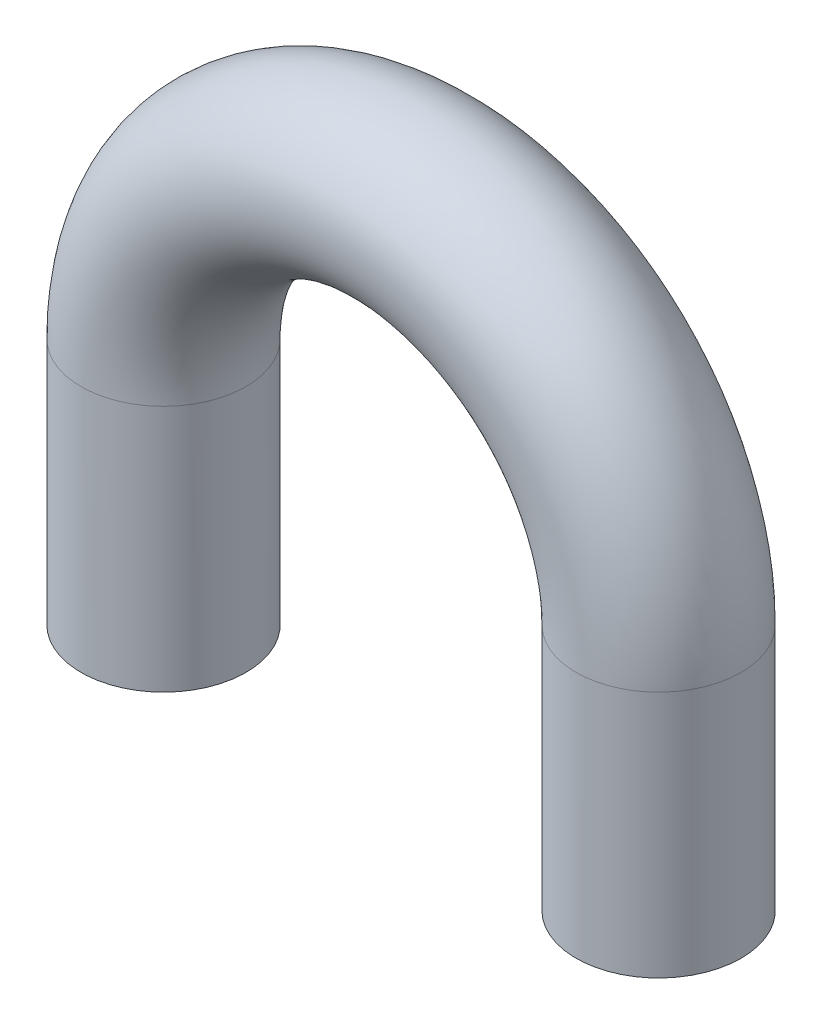
ISO-10303-21;
HEADER;
FILE_DESCRIPTION(('STEP AP214'),'2;1');
FILE_NAME('part.step','',(''),(''),'','','');
FILE_SCHEMA(('AUTOMOTIVE_DESIGN { 1 0 10303 214 1 1 1 1 }'));
ENDSEC;
DATA;
#1=APPLICATION_CONTEXT('core data for automotive mechanical design processes');
#2=APPLICATION_PROTOCOL_DEFINITION('international standard','automotive_design',2000,#1);
#3=PRODUCT_CONTEXT('',#1,'mechanical');
#4=PRODUCT('Part','Part','',(#3));
#5=PRODUCT_RELATED_PRODUCT_CATEGORY('part','',(#4));
#6=PRODUCT_DEFINITION_FORMATION('','',#4);
#7=PRODUCT_DEFINITION_CONTEXT('part definition',#1,'design');
#8=PRODUCT_DEFINITION('design','',#6,#7);
#9=PRODUCT_DEFINITION_SHAPE('','',#8);
#10=(LENGTH_UNIT() NAMED_UNIT(*) SI_UNIT(.MILLI.,.METRE.));
#11=(NAMED_UNIT(*) PLANE_ANGLE_UNIT() SI_UNIT($,.RADIAN.));
#12=(NAMED_UNIT(*) SI_UNIT($,.STERADIAN.) SOLID_ANGLE_UNIT());
#13=UNCERTAINTY_MEASURE_WITH_UNIT(LENGTH_MEASURE(1.E-05),#10,'distance_accuracy_value','');
#14=(GEOMETRIC_REPRESENTATION_CONTEXT(3) GLOBAL_UNCERTAINTY_ASSIGNED_CONTEXT((#13)) GLOBAL_UNIT_ASSIGNED_CONTEXT((#10,
#11,#12)) REPRESENTATION_CONTEXT('',''));
#15=CARTESIAN_POINT('',(0.,0.,0.));
#16=DIRECTION('',(0.,0.,1.));
#17=DIRECTION('',(1.,0.,0.));
#18=AXIS2_PLACEMENT_3D('',#15,#16,#17);
#19=CARTESIAN_POINT('',(-3.,3.,0.));
#20=DIRECTION('',(0.,-1.,0.));
#21=DIRECTION('',(1.,0.,0.));
#22=AXIS2_PLACEMENT_3D('',#19,#20,#21);
#23=CYLINDRICAL_SURFACE('',#22,1.);
#24=CARTESIAN_POINT('',(-3.,3.,0.));
#25=DIRECTION('',(0.,1.,0.));
#26=DIRECTION('',(0.,0.,-1.));
#27=AXIS2_PLACEMENT_3D('',#24,#25,#26);
#28=CIRCLE('',#27,1.);
#29=CARTESIAN_POINT('',(-4.,3.,0.));
#30=VERTEX_POINT('',#29);
#31=EDGE_CURVE('E45',#30,#30,#28,.T.);
#32=ORIENTED_EDGE('',*,*,#31,.F.);
#33=EDGE_LOOP('',(#32));
#34=FACE_BOUND('',#33,.T.);
#35=CARTESIAN_POINT('',(-3.,0.,0.));
#36=DIRECTION('',(0.,1.,0.));
#37=DIRECTION('',(0.,0.,-1.));
#38=AXIS2_PLACEMENT_3D('',#35,#36,#37);
#39=CIRCLE('',#38,1.);
#40=CARTESIAN_POINT('',(-3.,0.,-1.));
#41=VERTEX_POINT('',#40);
#42=EDGE_CURVE('E10',#41,#41,#39,.T.);
#43=ORIENTED_EDGE('',*,*,#42,.T.);
#44=EDGE_LOOP('',(#43));
#45=FACE_BOUND('',#44,.T.);
#46=ADVANCED_FACE('F39',(#34,#45),#23,.T.);
#47=CARTESIAN_POINT('',(0.,3.,0.));
#48=DIRECTION('',(0.,0.,-1.));
#49=DIRECTION('',(1.,0.,0.));
#50=AXIS2_PLACEMENT_3D('',#47,#48,#49);
#51=TOROIDAL_SURFACE('',#50,3.,1.);
#52=CARTESIAN_POINT('',(3.,3.,0.));
#53=DIRECTION('',(0.,-1.,0.));
#54=DIRECTION('',(0.,0.,-1.));
#55=AXIS2_PLACEMENT_3D('',#52,#53,#54);
#56=CIRCLE('',#55,1.);
#57=CARTESIAN_POINT('',(4.,3.,0.));
#58=VERTEX_POINT('',#57);
#59=EDGE_CURVE('E49',#58,#58,#56,.T.);
#60=CARTESIAN_POINT('',(0.,3.,0.));
#61=DIRECTION('',(0.,0.,-1.));
#62=DIRECTION('',(1.,0.,0.));
#63=AXIS2_PLACEMENT_3D('',#60,#61,#62);
#64=CIRCLE('',#63,4.);
#65=EDGE_CURVE('',#30,#58,#64,.T.);
#66=ORIENTED_EDGE('',*,*,#31,.T.);
#67=ORIENTED_EDGE('',*,*,#59,.F.);
#68=ORIENTED_EDGE('',*,*,#65,.T.);
#69=ORIENTED_EDGE('',*,*,#65,.F.);
#70=EDGE_LOOP('',(#66,#68,#67,#69));
#71=FACE_BOUND('',#70,.T.);
#72=ADVANCED_FACE('F64',(#71),#51,.T.);
#73=CARTESIAN_POINT('',(3.,3.,0.));
#74=DIRECTION('',(0.,-1.,0.));
#75=DIRECTION('',(1.,0.,0.));
#76=AXIS2_PLACEMENT_3D('',#73,#74,#75);
#77=CYLINDRICAL_SURFACE('',#76,1.);
#78=ORIENTED_EDGE('',*,*,#59,.T.);
#79=EDGE_LOOP('',(#78));
#80=FACE_BOUND('',#79,.T.);
#81=CARTESIAN_POINT('',(3.,0.,0.));
#82=DIRECTION('',(0.,-1.,0.));
#83=DIRECTION('',(0.,0.,-1.));
#84=AXIS2_PLACEMENT_3D('',#81,#82,#83);
#85=CIRCLE('',#84,1.);
#86=CARTESIAN_POINT('',(3.,0.,-1.));
#87=VERTEX_POINT('',#86);
#88=EDGE_CURVE('E53',#87,#87,#85,.T.);
#89=ORIENTED_EDGE('',*,*,#88,.F.);
#90=EDGE_LOOP('',(#89));
#91=FACE_BOUND('',#90,.T.);
#92=ADVANCED_FACE('F61',(#80,#91),#77,.T.);
#93=CARTESIAN_POINT('',(-3.,0.,0.));
#94=DIRECTION('',(0.,-1.,0.));
#95=DIRECTION('',(0.,0.,-1.));
#96=AXIS2_PLACEMENT_3D('',#93,#94,#95);
#97=PLANE('',#96);
#98=ORIENTED_EDGE('',*,*,#42,.F.);
#99=EDGE_LOOP('',(#98));
#100=FACE_BOUND('',#99,.T.);
#101=ADVANCED_FACE('F63',(#100),#97,.T.);
#102=CARTESIAN_POINT('',(3.,0.,0.));
#103=DIRECTION('',(0.,1.,0.));
#104=DIRECTION('',(0.,0.,-1.));
#105=AXIS2_PLACEMENT_3D('',#102,#103,#104);
#106=PLANE('',#105);
#107=ORIENTED_EDGE('',*,*,#88,.T.);
#108=EDGE_LOOP('',(#107));
#109=FACE_BOUND('',#108,.T.);
#110=ADVANCED_FACE('F59',(#109),#106,.F.);
#111=CLOSED_SHELL('',(#46,#72,#92,#101,#110));
#112=MANIFOLD_SOLID_BREP('B2',#111);
#113=ADVANCED_BREP_SHAPE_REPRESENTATION('',(#18,#112),#14);
#114=SHAPE_DEFINITION_REPRESENTATION(#9,#113);
ENDSEC;
END-ISO-10303-21;
